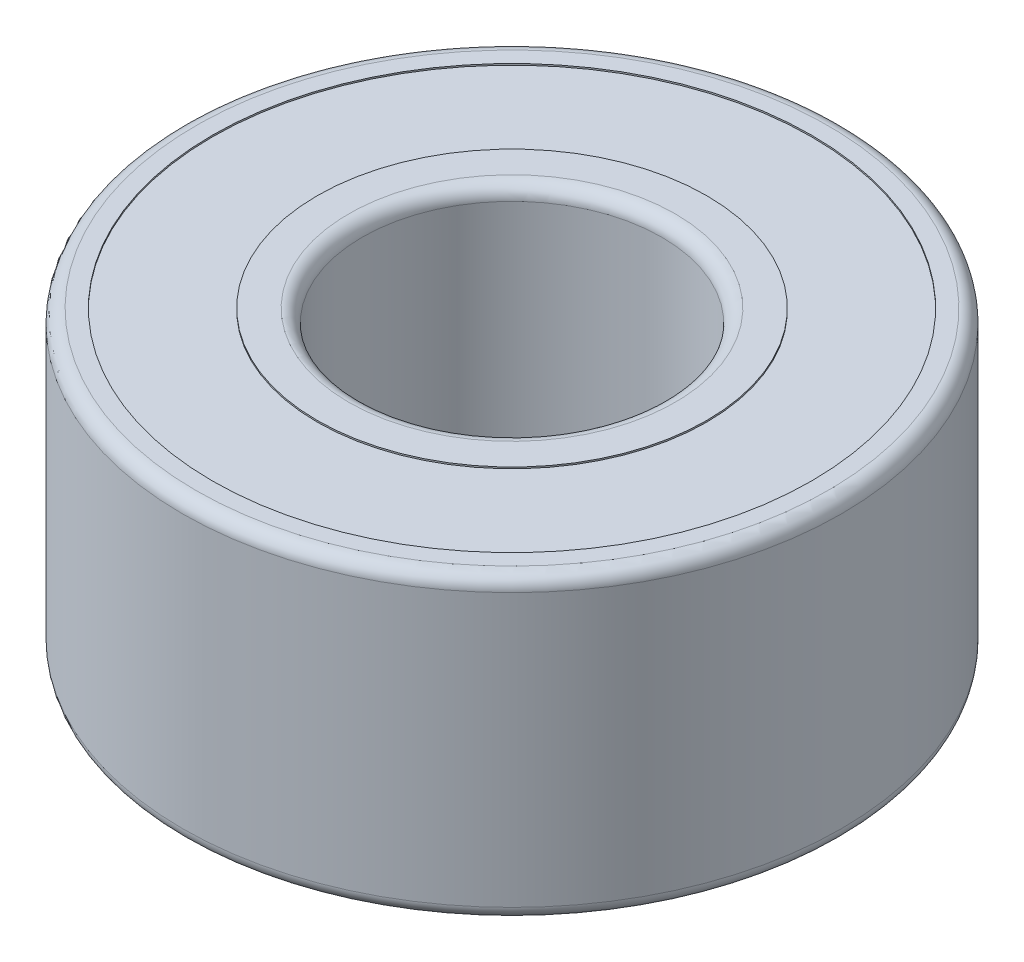
ISO-10303-21;
HEADER;
FILE_DESCRIPTION(('STEP AP214'),'2;1');
FILE_NAME('part.step','',(''),(''),'','','');
FILE_SCHEMA(('AUTOMOTIVE_DESIGN { 1 0 10303 214 1 1 1 1 }'));
ENDSEC;
DATA;
#1=APPLICATION_CONTEXT('core data for automotive mechanical design processes');
#2=APPLICATION_PROTOCOL_DEFINITION('international standard','automotive_design',2000,#1);
#3=PRODUCT_CONTEXT('',#1,'mechanical');
#4=PRODUCT('Part','Part','',(#3));
#5=PRODUCT_RELATED_PRODUCT_CATEGORY('part','',(#4));
#6=PRODUCT_DEFINITION_FORMATION('','',#4);
#7=PRODUCT_DEFINITION_CONTEXT('part definition',#1,'design');
#8=PRODUCT_DEFINITION('design','',#6,#7);
#9=PRODUCT_DEFINITION_SHAPE('','',#8);
#10=(LENGTH_UNIT() NAMED_UNIT(*) SI_UNIT(.MILLI.,.METRE.));
#11=(NAMED_UNIT(*) PLANE_ANGLE_UNIT() SI_UNIT($,.RADIAN.));
#12=(NAMED_UNIT(*) SI_UNIT($,.STERADIAN.) SOLID_ANGLE_UNIT());
#13=UNCERTAINTY_MEASURE_WITH_UNIT(LENGTH_MEASURE(1.E-05),#10,'distance_accuracy_value','');
#14=(GEOMETRIC_REPRESENTATION_CONTEXT(3) GLOBAL_UNCERTAINTY_ASSIGNED_CONTEXT((#13)) GLOBAL_UNIT_ASSIGNED_CONTEXT((#10,
#11,#12)) REPRESENTATION_CONTEXT('',''));
#15=CARTESIAN_POINT('',(0.,0.,0.));
#16=DIRECTION('',(0.,0.,1.));
#17=DIRECTION('',(1.,0.,0.));
#18=AXIS2_PLACEMENT_3D('',#15,#16,#17);
#19=CARTESIAN_POINT('',(0.,-5.,0.));
#20=DIRECTION('',(0.,1.,0.));
#21=DIRECTION('',(0.,0.,1.));
#22=AXIS2_PLACEMENT_3D('',#19,#20,#21);
#23=PLANE('',#22);
#24=CARTESIAN_POINT('',(0.,-5.,0.));
#25=DIRECTION('',(0.,1.,0.));
#26=DIRECTION('',(0.,0.,1.));
#27=AXIS2_PLACEMENT_3D('',#24,#25,#26);
#28=CIRCLE('',#27,5.45);
#29=CARTESIAN_POINT('',(0.,-5.,5.45));
#30=VERTEX_POINT('',#29);
#31=EDGE_CURVE('E67',#30,#30,#28,.T.);
#32=ORIENTED_EDGE('',*,*,#31,.T.);
#33=EDGE_LOOP('',(#32));
#34=FACE_BOUND('',#33,.T.);
#35=CARTESIAN_POINT('',(0.,-5.,0.));
#36=DIRECTION('',(0.,1.,0.));
#37=DIRECTION('',(0.,0.,1.));
#38=AXIS2_PLACEMENT_3D('',#35,#36,#37);
#39=CIRCLE('',#38,6.5);
#40=CARTESIAN_POINT('',(0.,-5.,6.5));
#41=VERTEX_POINT('',#40);
#42=EDGE_CURVE('E114',#41,#41,#39,.T.);
#43=ORIENTED_EDGE('',*,*,#42,.F.);
#44=EDGE_LOOP('',(#43));
#45=FACE_BOUND('',#44,.T.);
#46=ADVANCED_FACE('F49',(#34,#45),#23,.F.);
#47=CARTESIAN_POINT('',(0.,5.,0.));
#48=DIRECTION('',(0.,1.,0.));
#49=DIRECTION('',(0.,0.,1.));
#50=AXIS2_PLACEMENT_3D('',#47,#48,#49);
#51=PLANE('',#50);
#52=CARTESIAN_POINT('',(0.,5.,0.));
#53=DIRECTION('',(0.,1.,0.));
#54=DIRECTION('',(0.,0.,1.));
#55=AXIS2_PLACEMENT_3D('',#52,#53,#54);
#56=CIRCLE('',#55,5.45);
#57=CARTESIAN_POINT('',(0.,5.,5.45));
#58=VERTEX_POINT('',#57);
#59=EDGE_CURVE('E10',#58,#58,#56,.F.);
#60=ORIENTED_EDGE('',*,*,#59,.T.);
#61=EDGE_LOOP('',(#60));
#62=FACE_BOUND('',#61,.T.);
#63=CARTESIAN_POINT('',(0.,5.,0.));
#64=DIRECTION('',(0.,1.,0.));
#65=DIRECTION('',(0.,0.,1.));
#66=AXIS2_PLACEMENT_3D('',#63,#64,#65);
#67=CIRCLE('',#66,6.5);
#68=CARTESIAN_POINT('',(0.,5.,6.5));
#69=VERTEX_POINT('',#68);
#70=EDGE_CURVE('E98',#69,#69,#67,.T.);
#71=ORIENTED_EDGE('',*,*,#70,.T.);
#72=EDGE_LOOP('',(#71));
#73=FACE_BOUND('',#72,.T.);
#74=ADVANCED_FACE('F133',(#62,#73),#51,.T.);
#75=CARTESIAN_POINT('',(0.,5.,0.));
#76=DIRECTION('',(0.,1.,0.));
#77=DIRECTION('',(0.,0.,1.));
#78=AXIS2_PLACEMENT_3D('',#75,#76,#77);
#79=CIRCLE('',#78,10.55);
#80=CARTESIAN_POINT('',(0.,5.,10.55));
#81=VERTEX_POINT('',#80);
#82=EDGE_CURVE('E73',#81,#81,#79,.T.);
#83=ORIENTED_EDGE('',*,*,#82,.T.);
#84=EDGE_LOOP('',(#83));
#85=FACE_BOUND('',#84,.T.);
#86=CARTESIAN_POINT('',(0.,5.,0.));
#87=DIRECTION('',(0.,1.,0.));
#88=DIRECTION('',(0.,0.,1.));
#89=AXIS2_PLACEMENT_3D('',#86,#87,#88);
#90=CIRCLE('',#89,10.);
#91=CARTESIAN_POINT('',(0.,5.,10.));
#92=VERTEX_POINT('',#91);
#93=EDGE_CURVE('E90',#92,#92,#90,.T.);
#94=ORIENTED_EDGE('',*,*,#93,.F.);
#95=EDGE_LOOP('',(#94));
#96=FACE_BOUND('',#95,.T.);
#97=ADVANCED_FACE('F140',(#85,#96),#51,.T.);
#98=CARTESIAN_POINT('',(0.,-5.,0.));
#99=DIRECTION('',(0.,1.,0.));
#100=DIRECTION('',(0.,0.,1.));
#101=AXIS2_PLACEMENT_3D('',#98,#99,#100);
#102=CIRCLE('',#101,10.55);
#103=CARTESIAN_POINT('',(0.,-5.,10.55));
#104=VERTEX_POINT('',#103);
#105=EDGE_CURVE('E77',#104,#104,#102,.F.);
#106=ORIENTED_EDGE('',*,*,#105,.T.);
#107=EDGE_LOOP('',(#106));
#108=FACE_BOUND('',#107,.T.);
#109=CARTESIAN_POINT('',(0.,-5.,0.));
#110=DIRECTION('',(0.,1.,0.));
#111=DIRECTION('',(0.,0.,1.));
#112=AXIS2_PLACEMENT_3D('',#109,#110,#111);
#113=CIRCLE('',#112,10.);
#114=CARTESIAN_POINT('',(0.,-5.,10.));
#115=VERTEX_POINT('',#114);
#116=EDGE_CURVE('E106',#115,#115,#113,.T.);
#117=ORIENTED_EDGE('',*,*,#116,.T.);
#118=EDGE_LOOP('',(#117));
#119=FACE_BOUND('',#118,.T.);
#120=ADVANCED_FACE('F136',(#108,#119),#23,.F.);
#121=CARTESIAN_POINT('',(0.,5.,0.));
#122=DIRECTION('',(0.,-1.,0.));
#123=DIRECTION('',(0.,0.,-1.));
#124=AXIS2_PLACEMENT_3D('',#121,#122,#123);
#125=CYLINDRICAL_SURFACE('',#124,11.);
#126=CARTESIAN_POINT('',(0.,-4.55,0.));
#127=DIRECTION('',(0.,1.,0.));
#128=DIRECTION('',(0.,0.,1.));
#129=AXIS2_PLACEMENT_3D('',#126,#127,#128);
#130=CIRCLE('',#129,11.);
#131=CARTESIAN_POINT('',(0.,-4.55,11.));
#132=VERTEX_POINT('',#131);
#133=EDGE_CURVE('E81',#132,#132,#130,.T.);
#134=ORIENTED_EDGE('',*,*,#133,.T.);
#135=EDGE_LOOP('',(#134));
#136=FACE_BOUND('',#135,.T.);
#137=CARTESIAN_POINT('',(0.,4.55,0.));
#138=DIRECTION('',(0.,1.,0.));
#139=DIRECTION('',(0.,0.,1.));
#140=AXIS2_PLACEMENT_3D('',#137,#138,#139);
#141=CIRCLE('',#140,11.);
#142=CARTESIAN_POINT('',(0.,4.55,11.));
#143=VERTEX_POINT('',#142);
#144=EDGE_CURVE('E85',#143,#143,#141,.F.);
#145=ORIENTED_EDGE('',*,*,#144,.T.);
#146=EDGE_LOOP('',(#145));
#147=FACE_BOUND('',#146,.T.);
#148=ADVANCED_FACE('F144',(#136,#147),#125,.T.);
#149=CARTESIAN_POINT('',(0.,5.,0.));
#150=DIRECTION('',(0.,-1.,0.));
#151=DIRECTION('',(0.,0.,-1.));
#152=AXIS2_PLACEMENT_3D('',#149,#150,#151);
#153=CYLINDRICAL_SURFACE('',#152,5.);
#154=CARTESIAN_POINT('',(0.,-4.55,0.));
#155=DIRECTION('',(0.,1.,0.));
#156=DIRECTION('',(0.,0.,1.));
#157=AXIS2_PLACEMENT_3D('',#154,#155,#156);
#158=CIRCLE('',#157,5.);
#159=CARTESIAN_POINT('',(0.,-4.55,5.));
#160=VERTEX_POINT('',#159);
#161=EDGE_CURVE('E57',#160,#160,#158,.F.);
#162=ORIENTED_EDGE('',*,*,#161,.T.);
#163=EDGE_LOOP('',(#162));
#164=FACE_BOUND('',#163,.T.);
#165=CARTESIAN_POINT('',(0.,4.55,0.));
#166=DIRECTION('',(0.,1.,0.));
#167=DIRECTION('',(0.,0.,1.));
#168=AXIS2_PLACEMENT_3D('',#165,#166,#167);
#169=CIRCLE('',#168,5.);
#170=CARTESIAN_POINT('',(0.,4.55,5.));
#171=VERTEX_POINT('',#170);
#172=EDGE_CURVE('E62',#171,#171,#169,.T.);
#173=ORIENTED_EDGE('',*,*,#172,.T.);
#174=EDGE_LOOP('',(#173));
#175=FACE_BOUND('',#174,.T.);
#176=ADVANCED_FACE('F150',(#164,#175),#153,.F.);
#177=CARTESIAN_POINT('',(0.,4.95,0.));
#178=DIRECTION('',(0.,1.,0.));
#179=DIRECTION('',(0.,0.,1.));
#180=AXIS2_PLACEMENT_3D('',#177,#178,#179);
#181=CYLINDRICAL_SURFACE('',#180,10.);
#182=CARTESIAN_POINT('',(0.,4.95,0.));
#183=DIRECTION('',(0.,1.,0.));
#184=DIRECTION('',(0.,0.,1.));
#185=AXIS2_PLACEMENT_3D('',#182,#183,#184);
#186=CIRCLE('',#185,10.);
#187=CARTESIAN_POINT('',(0.,4.95,10.));
#188=VERTEX_POINT('',#187);
#189=EDGE_CURVE('E89',#188,#188,#186,.T.);
#190=ORIENTED_EDGE('',*,*,#189,.F.);
#191=EDGE_LOOP('',(#190));
#192=FACE_BOUND('',#191,.T.);
#193=ORIENTED_EDGE('',*,*,#93,.T.);
#194=EDGE_LOOP('',(#193));
#195=FACE_BOUND('',#194,.T.);
#196=ADVANCED_FACE('F174',(#192,#195),#181,.F.);
#197=CARTESIAN_POINT('',(0.,4.95,0.));
#198=DIRECTION('',(0.,1.,0.));
#199=DIRECTION('',(0.,0.,1.));
#200=AXIS2_PLACEMENT_3D('',#197,#198,#199);
#201=PLANE('',#200);
#202=CARTESIAN_POINT('',(0.,4.95,0.));
#203=DIRECTION('',(0.,1.,0.));
#204=DIRECTION('',(0.,0.,1.));
#205=AXIS2_PLACEMENT_3D('',#202,#203,#204);
#206=CIRCLE('',#205,6.5);
#207=CARTESIAN_POINT('',(0.,4.95,6.5));
#208=VERTEX_POINT('',#207);
#209=EDGE_CURVE('E94',#208,#208,#206,.T.);
#210=ORIENTED_EDGE('',*,*,#209,.F.);
#211=EDGE_LOOP('',(#210));
#212=FACE_BOUND('',#211,.T.);
#213=ORIENTED_EDGE('',*,*,#189,.T.);
#214=EDGE_LOOP('',(#213));
#215=FACE_BOUND('',#214,.T.);
#216=ADVANCED_FACE('F170',(#212,#215),#201,.T.);
#217=CARTESIAN_POINT('',(0.,4.95,0.));
#218=DIRECTION('',(0.,1.,0.));
#219=DIRECTION('',(0.,0.,1.));
#220=AXIS2_PLACEMENT_3D('',#217,#218,#219);
#221=CYLINDRICAL_SURFACE('',#220,6.5);
#222=ORIENTED_EDGE('',*,*,#209,.T.);
#223=EDGE_LOOP('',(#222));
#224=FACE_BOUND('',#223,.T.);
#225=ORIENTED_EDGE('',*,*,#70,.F.);
#226=EDGE_LOOP('',(#225));
#227=FACE_BOUND('',#226,.T.);
#228=ADVANCED_FACE('F164',(#224,#227),#221,.T.);
#229=CARTESIAN_POINT('',(0.,-4.95,0.));
#230=DIRECTION('',(0.,-1.,0.));
#231=DIRECTION('',(0.,0.,1.));
#232=AXIS2_PLACEMENT_3D('',#229,#230,#231);
#233=PLANE('',#232);
#234=CARTESIAN_POINT('',(0.,-4.95,0.));
#235=DIRECTION('',(0.,1.,0.));
#236=DIRECTION('',(0.,0.,1.));
#237=AXIS2_PLACEMENT_3D('',#234,#235,#236);
#238=CIRCLE('',#237,10.);
#239=CARTESIAN_POINT('',(0.,-4.95,10.));
#240=VERTEX_POINT('',#239);
#241=EDGE_CURVE('E102',#240,#240,#238,.T.);
#242=ORIENTED_EDGE('',*,*,#241,.F.);
#243=EDGE_LOOP('',(#242));
#244=FACE_BOUND('',#243,.T.);
#245=CARTESIAN_POINT('',(0.,-4.95,0.));
#246=DIRECTION('',(0.,1.,0.));
#247=DIRECTION('',(0.,0.,1.));
#248=AXIS2_PLACEMENT_3D('',#245,#246,#247);
#249=CIRCLE('',#248,6.5);
#250=CARTESIAN_POINT('',(0.,-4.95,6.5));
#251=VERTEX_POINT('',#250);
#252=EDGE_CURVE('E110',#251,#251,#249,.T.);
#253=ORIENTED_EDGE('',*,*,#252,.T.);
#254=EDGE_LOOP('',(#253));
#255=FACE_BOUND('',#254,.T.);
#256=ADVANCED_FACE('F122',(#244,#255),#233,.T.);
#257=CARTESIAN_POINT('',(0.,-4.95,0.));
#258=DIRECTION('',(0.,-1.,0.));
#259=DIRECTION('',(0.,0.,-1.));
#260=AXIS2_PLACEMENT_3D('',#257,#258,#259);
#261=CYLINDRICAL_SURFACE('',#260,10.);
#262=ORIENTED_EDGE('',*,*,#241,.T.);
#263=EDGE_LOOP('',(#262));
#264=FACE_BOUND('',#263,.T.);
#265=ORIENTED_EDGE('',*,*,#116,.F.);
#266=EDGE_LOOP('',(#265));
#267=FACE_BOUND('',#266,.T.);
#268=ADVANCED_FACE('F128',(#264,#267),#261,.F.);
#269=CARTESIAN_POINT('',(0.,-4.95,0.));
#270=DIRECTION('',(0.,-1.,0.));
#271=DIRECTION('',(0.,0.,-1.));
#272=AXIS2_PLACEMENT_3D('',#269,#270,#271);
#273=CYLINDRICAL_SURFACE('',#272,6.5);
#274=ORIENTED_EDGE('',*,*,#252,.F.);
#275=EDGE_LOOP('',(#274));
#276=FACE_BOUND('',#275,.T.);
#277=ORIENTED_EDGE('',*,*,#42,.T.);
#278=EDGE_LOOP('',(#277));
#279=FACE_BOUND('',#278,.T.);
#280=ADVANCED_FACE('F124',(#276,#279),#273,.T.);
#281=CARTESIAN_POINT('',(0.,-4.55,0.));
#282=DIRECTION('',(0.,1.,0.));
#283=DIRECTION('',(0.,0.,1.));
#284=AXIS2_PLACEMENT_3D('',#281,#282,#283);
#285=TOROIDAL_SURFACE('',#284,10.55,0.45);
#286=ORIENTED_EDGE('',*,*,#105,.F.);
#287=EDGE_LOOP('',(#286));
#288=FACE_BOUND('',#287,.T.);
#289=ORIENTED_EDGE('',*,*,#133,.F.);
#290=EDGE_LOOP('',(#289));
#291=FACE_BOUND('',#290,.T.);
#292=ADVANCED_FACE('F127',(#288,#291),#285,.T.);
#293=CARTESIAN_POINT('',(0.,4.55,0.));
#294=DIRECTION('',(0.,1.,0.));
#295=DIRECTION('',(0.,0.,1.));
#296=AXIS2_PLACEMENT_3D('',#293,#294,#295);
#297=TOROIDAL_SURFACE('',#296,10.55,0.45);
#298=ORIENTED_EDGE('',*,*,#144,.F.);
#299=EDGE_LOOP('',(#298));
#300=FACE_BOUND('',#299,.T.);
#301=ORIENTED_EDGE('',*,*,#82,.F.);
#302=EDGE_LOOP('',(#301));
#303=FACE_BOUND('',#302,.T.);
#304=ADVANCED_FACE('F192',(#300,#303),#297,.T.);
#305=CARTESIAN_POINT('',(0.,-4.55,0.));
#306=DIRECTION('',(0.,1.,0.));
#307=DIRECTION('',(0.,0.,1.));
#308=AXIS2_PLACEMENT_3D('',#305,#306,#307);
#309=TOROIDAL_SURFACE('',#308,5.45,0.45);
#310=ORIENTED_EDGE('',*,*,#161,.F.);
#311=EDGE_LOOP('',(#310));
#312=FACE_BOUND('',#311,.T.);
#313=ORIENTED_EDGE('',*,*,#31,.F.);
#314=EDGE_LOOP('',(#313));
#315=FACE_BOUND('',#314,.T.);
#316=ADVANCED_FACE('F187',(#312,#315),#309,.T.);
#317=CARTESIAN_POINT('',(0.,4.55,0.));
#318=DIRECTION('',(0.,1.,0.));
#319=DIRECTION('',(0.,0.,1.));
#320=AXIS2_PLACEMENT_3D('',#317,#318,#319);
#321=TOROIDAL_SURFACE('',#320,5.45,0.45);
#322=ORIENTED_EDGE('',*,*,#59,.F.);
#323=EDGE_LOOP('',(#322));
#324=FACE_BOUND('',#323,.T.);
#325=ORIENTED_EDGE('',*,*,#172,.F.);
#326=EDGE_LOOP('',(#325));
#327=FACE_BOUND('',#326,.T.);
#328=ADVANCED_FACE('F51',(#324,#327),#321,.T.);
#329=CLOSED_SHELL('',(#46,#74,#97,#120,#148,#176,#196,#216,#228,#256,#268,#280,#292,#304,#316,#328));
#330=MANIFOLD_SOLID_BREP('B2',#329);
#331=ADVANCED_BREP_SHAPE_REPRESENTATION('',(#18,#330),#14);
#332=SHAPE_DEFINITION_REPRESENTATION(#9,#331);
ENDSEC;
END-ISO-10303-21;
